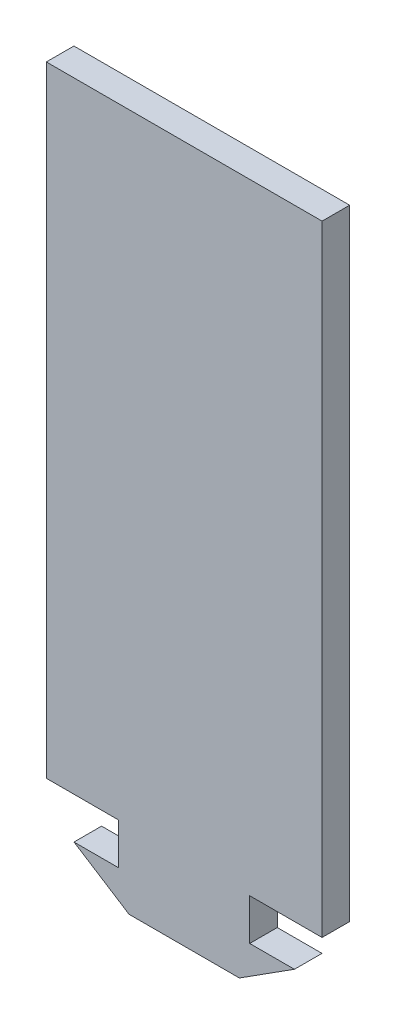
ISO-10303-21;
HEADER;
FILE_DESCRIPTION(('STEP AP214'),'2;1');
FILE_NAME('part.step','',(''),(''),'','','');
FILE_SCHEMA(('AUTOMOTIVE_DESIGN { 1 0 10303 214 1 1 1 1 }'));
ENDSEC;
DATA;
#1=APPLICATION_CONTEXT('core data for automotive mechanical design processes');
#2=APPLICATION_PROTOCOL_DEFINITION('international standard','automotive_design',2000,#1);
#3=PRODUCT_CONTEXT('',#1,'mechanical');
#4=PRODUCT('Part','Part','',(#3));
#5=PRODUCT_RELATED_PRODUCT_CATEGORY('part','',(#4));
#6=PRODUCT_DEFINITION_FORMATION('','',#4);
#7=PRODUCT_DEFINITION_CONTEXT('part definition',#1,'design');
#8=PRODUCT_DEFINITION('design','',#6,#7);
#9=PRODUCT_DEFINITION_SHAPE('','',#8);
#10=(LENGTH_UNIT() NAMED_UNIT(*) SI_UNIT(.MILLI.,.METRE.));
#11=(NAMED_UNIT(*) PLANE_ANGLE_UNIT() SI_UNIT($,.RADIAN.));
#12=(NAMED_UNIT(*) SI_UNIT($,.STERADIAN.) SOLID_ANGLE_UNIT());
#13=UNCERTAINTY_MEASURE_WITH_UNIT(LENGTH_MEASURE(1.E-05),#10,'distance_accuracy_value','');
#14=(GEOMETRIC_REPRESENTATION_CONTEXT(3) GLOBAL_UNCERTAINTY_ASSIGNED_CONTEXT((#13)) GLOBAL_UNIT_ASSIGNED_CONTEXT((#10,
#11,#12)) REPRESENTATION_CONTEXT('',''));
#15=CARTESIAN_POINT('',(0.,0.,0.));
#16=DIRECTION('',(0.,0.,1.));
#17=DIRECTION('',(1.,0.,0.));
#18=AXIS2_PLACEMENT_3D('',#15,#16,#17);
#19=CARTESIAN_POINT('',(-10.,-22.5,2.));
#20=DIRECTION('',(1.,0.,0.));
#21=DIRECTION('',(0.,0.,-1.));
#22=AXIS2_PLACEMENT_3D('',#19,#20,#21);
#23=PLANE('',#22);
#24=DIRECTION('',(0.,-1.,0.));
#25=VECTOR('',#24,1.);
#26=CARTESIAN_POINT('',(-10.,-22.5,0.));
#27=LINE('',#26,#25);
#28=CARTESIAN_POINT('',(-10.,22.5,0.));
#29=VERTEX_POINT('',#28);
#30=CARTESIAN_POINT('',(-10.,-22.5,0.));
#31=VERTEX_POINT('',#30);
#32=EDGE_CURVE('E170',#29,#31,#27,.T.);
#33=ORIENTED_EDGE('',*,*,#32,.T.);
#34=DIRECTION('',(0.,0.,-1.));
#35=VECTOR('',#34,1.);
#36=CARTESIAN_POINT('',(-10.,-22.5,2.));
#37=LINE('',#36,#35);
#38=CARTESIAN_POINT('',(-10.,-22.5,2.));
#39=VERTEX_POINT('',#38);
#40=EDGE_CURVE('E11',#39,#31,#37,.T.);
#41=ORIENTED_EDGE('',*,*,#40,.F.);
#42=DIRECTION('',(0.,-1.,0.));
#43=VECTOR('',#42,1.);
#44=CARTESIAN_POINT('',(-10.,-22.5,2.));
#45=LINE('',#44,#43);
#46=CARTESIAN_POINT('',(-10.,22.5,2.));
#47=VERTEX_POINT('',#46);
#48=EDGE_CURVE('E204',#47,#39,#45,.T.);
#49=ORIENTED_EDGE('',*,*,#48,.F.);
#50=DIRECTION('',(0.,0.,-1.));
#51=VECTOR('',#50,1.);
#52=CARTESIAN_POINT('',(-10.,22.5,2.));
#53=LINE('',#52,#51);
#54=EDGE_CURVE('E166',#47,#29,#53,.T.);
#55=ORIENTED_EDGE('',*,*,#54,.T.);
#56=EDGE_LOOP('',(#33,#41,#49,#55));
#57=FACE_BOUND('',#56,.T.);
#58=ADVANCED_FACE('F45',(#57),#23,.F.);
#59=CARTESIAN_POINT('',(-4.75,-22.5,2.));
#60=DIRECTION('',(0.,1.,0.));
#61=DIRECTION('',(-1.,0.,0.));
#62=AXIS2_PLACEMENT_3D('',#59,#60,#61);
#63=PLANE('',#62);
#64=DIRECTION('',(1.,0.,0.));
#65=VECTOR('',#64,1.);
#66=CARTESIAN_POINT('',(-4.75,-22.5,0.));
#67=LINE('',#66,#65);
#68=CARTESIAN_POINT('',(-4.75,-22.5,0.));
#69=VERTEX_POINT('',#68);
#70=EDGE_CURVE('E174',#31,#69,#67,.T.);
#71=ORIENTED_EDGE('',*,*,#70,.T.);
#72=DIRECTION('',(0.,0.,-1.));
#73=VECTOR('',#72,1.);
#74=CARTESIAN_POINT('',(-4.75,-22.5,2.));
#75=LINE('',#74,#73);
#76=CARTESIAN_POINT('',(-4.75,-22.5,2.));
#77=VERTEX_POINT('',#76);
#78=EDGE_CURVE('E54',#77,#69,#75,.T.);
#79=ORIENTED_EDGE('',*,*,#78,.F.);
#80=DIRECTION('',(1.,0.,0.));
#81=VECTOR('',#80,1.);
#82=CARTESIAN_POINT('',(-4.75,-22.5,2.));
#83=LINE('',#82,#81);
#84=EDGE_CURVE('E117',#39,#77,#83,.T.);
#85=ORIENTED_EDGE('',*,*,#84,.F.);
#86=ORIENTED_EDGE('',*,*,#40,.T.);
#87=EDGE_LOOP('',(#71,#79,#85,#86));
#88=FACE_BOUND('',#87,.T.);
#89=ADVANCED_FACE('F298',(#88),#63,.F.);
#90=CARTESIAN_POINT('',(-4.75,-25.5,2.));
#91=DIRECTION('',(1.,0.,0.));
#92=DIRECTION('',(0.,1.,0.));
#93=AXIS2_PLACEMENT_3D('',#90,#91,#92);
#94=PLANE('',#93);
#95=DIRECTION('',(0.,-1.,0.));
#96=VECTOR('',#95,1.);
#97=CARTESIAN_POINT('',(-4.75,-25.5,0.));
#98=LINE('',#97,#96);
#99=CARTESIAN_POINT('',(-4.75,-25.5,0.));
#100=VERTEX_POINT('',#99);
#101=EDGE_CURVE('E177',#69,#100,#98,.T.);
#102=ORIENTED_EDGE('',*,*,#101,.T.);
#103=DIRECTION('',(0.,0.,-1.));
#104=VECTOR('',#103,1.);
#105=CARTESIAN_POINT('',(-4.75,-25.5,2.));
#106=LINE('',#105,#104);
#107=CARTESIAN_POINT('',(-4.75,-25.5,2.));
#108=VERTEX_POINT('',#107);
#109=EDGE_CURVE('E231',#108,#100,#106,.T.);
#110=ORIENTED_EDGE('',*,*,#109,.F.);
#111=DIRECTION('',(0.,-1.,0.));
#112=VECTOR('',#111,1.);
#113=CARTESIAN_POINT('',(-4.75,-25.5,2.));
#114=LINE('',#113,#112);
#115=EDGE_CURVE('E241',#77,#108,#114,.T.);
#116=ORIENTED_EDGE('',*,*,#115,.F.);
#117=ORIENTED_EDGE('',*,*,#78,.T.);
#118=EDGE_LOOP('',(#102,#110,#116,#117));
#119=FACE_BOUND('',#118,.T.);
#120=ADVANCED_FACE('F239',(#119),#94,.F.);
#121=CARTESIAN_POINT('',(-4.75,-25.5,2.));
#122=DIRECTION('',(0.,-1.,0.));
#123=DIRECTION('',(0.,0.,-1.));
#124=AXIS2_PLACEMENT_3D('',#121,#122,#123);
#125=PLANE('',#124);
#126=DIRECTION('',(-1.,0.,0.));
#127=VECTOR('',#126,1.);
#128=CARTESIAN_POINT('',(-4.75,-25.5,0.));
#129=LINE('',#128,#127);
#130=CARTESIAN_POINT('',(-7.99412202859091,-25.5,0.));
#131=VERTEX_POINT('',#130);
#132=EDGE_CURVE('E180',#100,#131,#129,.T.);
#133=ORIENTED_EDGE('',*,*,#132,.T.);
#134=DIRECTION('',(0.,0.,-1.));
#135=VECTOR('',#134,1.);
#136=CARTESIAN_POINT('',(-7.99412202859091,-25.5,2.));
#137=LINE('',#136,#135);
#138=CARTESIAN_POINT('',(-7.99412202859091,-25.5,2.));
#139=VERTEX_POINT('',#138);
#140=EDGE_CURVE('E227',#139,#131,#137,.T.);
#141=ORIENTED_EDGE('',*,*,#140,.F.);
#142=DIRECTION('',(-1.,0.,0.));
#143=VECTOR('',#142,1.);
#144=CARTESIAN_POINT('',(-4.75,-25.5,2.));
#145=LINE('',#144,#143);
#146=EDGE_CURVE('E260',#108,#139,#145,.T.);
#147=ORIENTED_EDGE('',*,*,#146,.F.);
#148=ORIENTED_EDGE('',*,*,#109,.T.);
#149=EDGE_LOOP('',(#133,#141,#147,#148));
#150=FACE_BOUND('',#149,.T.);
#151=ADVANCED_FACE('F250',(#150),#125,.F.);
#152=CARTESIAN_POINT('',(-7.99412202859091,-25.5,2.));
#153=DIRECTION('',(0.537210435880766,0.843448248312128,0.));
#154=DIRECTION('',(-0.843448248312128,0.537210435880766,0.));
#155=AXIS2_PLACEMENT_3D('',#152,#153,#154);
#156=PLANE('',#155);
#157=DIRECTION('',(0.843448248312128,-0.537210435880766,0.));
#158=VECTOR('',#157,1.);
#159=CARTESIAN_POINT('',(-7.99412202859091,-25.5,0.));
#160=LINE('',#159,#158);
#161=CARTESIAN_POINT('',(-4.,-28.0439427258686,0.));
#162=VERTEX_POINT('',#161);
#163=EDGE_CURVE('E183',#131,#162,#160,.T.);
#164=ORIENTED_EDGE('',*,*,#163,.T.);
#165=DIRECTION('',(0.,0.,-1.));
#166=VECTOR('',#165,1.);
#167=CARTESIAN_POINT('',(-4.,-28.0439427258686,2.));
#168=LINE('',#167,#166);
#169=CARTESIAN_POINT('',(-4.,-28.0439427258686,2.));
#170=VERTEX_POINT('',#169);
#171=EDGE_CURVE('E223',#170,#162,#168,.T.);
#172=ORIENTED_EDGE('',*,*,#171,.F.);
#173=DIRECTION('',(0.843448248312128,-0.537210435880766,0.));
#174=VECTOR('',#173,1.);
#175=CARTESIAN_POINT('',(-7.99412202859091,-25.5,2.));
#176=LINE('',#175,#174);
#177=EDGE_CURVE('E256',#139,#170,#176,.T.);
#178=ORIENTED_EDGE('',*,*,#177,.F.);
#179=ORIENTED_EDGE('',*,*,#140,.T.);
#180=EDGE_LOOP('',(#164,#172,#178,#179));
#181=FACE_BOUND('',#180,.T.);
#182=ADVANCED_FACE('F254',(#181),#156,.F.);
#183=CARTESIAN_POINT('',(-4.,-28.0439427258686,2.));
#184=DIRECTION('',(0.,1.,0.));
#185=DIRECTION('',(0.,0.,1.));
#186=AXIS2_PLACEMENT_3D('',#183,#184,#185);
#187=PLANE('',#186);
#188=DIRECTION('',(1.,0.,0.));
#189=VECTOR('',#188,1.);
#190=CARTESIAN_POINT('',(-4.,-28.0439427258686,0.));
#191=LINE('',#190,#189);
#192=CARTESIAN_POINT('',(4.,-28.0439427258686,0.));
#193=VERTEX_POINT('',#192);
#194=EDGE_CURVE('E186',#162,#193,#191,.T.);
#195=ORIENTED_EDGE('',*,*,#194,.T.);
#196=DIRECTION('',(0.,0.,-1.));
#197=VECTOR('',#196,1.);
#198=CARTESIAN_POINT('',(4.,-28.0439427258686,2.));
#199=LINE('',#198,#197);
#200=CARTESIAN_POINT('',(4.,-28.0439427258686,2.));
#201=VERTEX_POINT('',#200);
#202=EDGE_CURVE('E219',#201,#193,#199,.T.);
#203=ORIENTED_EDGE('',*,*,#202,.F.);
#204=DIRECTION('',(1.,0.,0.));
#205=VECTOR('',#204,1.);
#206=CARTESIAN_POINT('',(-4.,-28.0439427258686,2.));
#207=LINE('',#206,#205);
#208=EDGE_CURVE('E259',#170,#201,#207,.T.);
#209=ORIENTED_EDGE('',*,*,#208,.F.);
#210=ORIENTED_EDGE('',*,*,#171,.T.);
#211=EDGE_LOOP('',(#195,#203,#209,#210));
#212=FACE_BOUND('',#211,.T.);
#213=ADVANCED_FACE('F311',(#212),#187,.F.);
#214=CARTESIAN_POINT('',(4.,-28.0439427258686,2.));
#215=DIRECTION('',(-0.537210435880766,0.843448248312128,0.));
#216=DIRECTION('',(-0.843448248312128,-0.537210435880766,0.));
#217=AXIS2_PLACEMENT_3D('',#214,#215,#216);
#218=PLANE('',#217);
#219=DIRECTION('',(0.843448248312128,0.537210435880766,0.));
#220=VECTOR('',#219,1.);
#221=CARTESIAN_POINT('',(4.,-28.0439427258686,0.));
#222=LINE('',#221,#220);
#223=CARTESIAN_POINT('',(7.99412202859091,-25.5,0.));
#224=VERTEX_POINT('',#223);
#225=EDGE_CURVE('E189',#193,#224,#222,.T.);
#226=ORIENTED_EDGE('',*,*,#225,.T.);
#227=DIRECTION('',(0.,0.,-1.));
#228=VECTOR('',#227,1.);
#229=CARTESIAN_POINT('',(7.99412202859091,-25.5,2.));
#230=LINE('',#229,#228);
#231=CARTESIAN_POINT('',(7.99412202859091,-25.5,2.));
#232=VERTEX_POINT('',#231);
#233=EDGE_CURVE('E215',#232,#224,#230,.T.);
#234=ORIENTED_EDGE('',*,*,#233,.F.);
#235=DIRECTION('',(0.843448248312128,0.537210435880766,0.));
#236=VECTOR('',#235,1.);
#237=CARTESIAN_POINT('',(4.,-28.0439427258686,2.));
#238=LINE('',#237,#236);
#239=EDGE_CURVE('E264',#201,#232,#238,.T.);
#240=ORIENTED_EDGE('',*,*,#239,.F.);
#241=ORIENTED_EDGE('',*,*,#202,.T.);
#242=EDGE_LOOP('',(#226,#234,#240,#241));
#243=FACE_BOUND('',#242,.T.);
#244=ADVANCED_FACE('F314',(#243),#218,.F.);
#245=CARTESIAN_POINT('',(4.75,-25.5,2.));
#246=DIRECTION('',(0.,-1.,0.));
#247=DIRECTION('',(1.,0.,0.));
#248=AXIS2_PLACEMENT_3D('',#245,#246,#247);
#249=PLANE('',#248);
#250=DIRECTION('',(-1.,0.,0.));
#251=VECTOR('',#250,1.);
#252=CARTESIAN_POINT('',(4.75,-25.5,0.));
#253=LINE('',#252,#251);
#254=CARTESIAN_POINT('',(4.75,-25.5,0.));
#255=VERTEX_POINT('',#254);
#256=EDGE_CURVE('E192',#224,#255,#253,.T.);
#257=ORIENTED_EDGE('',*,*,#256,.T.);
#258=DIRECTION('',(0.,0.,-1.));
#259=VECTOR('',#258,1.);
#260=CARTESIAN_POINT('',(4.75,-25.5,2.));
#261=LINE('',#260,#259);
#262=CARTESIAN_POINT('',(4.75,-25.5,2.));
#263=VERTEX_POINT('',#262);
#264=EDGE_CURVE('E211',#263,#255,#261,.T.);
#265=ORIENTED_EDGE('',*,*,#264,.F.);
#266=DIRECTION('',(-1.,0.,0.));
#267=VECTOR('',#266,1.);
#268=CARTESIAN_POINT('',(4.75,-25.5,2.));
#269=LINE('',#268,#267);
#270=EDGE_CURVE('E271',#232,#263,#269,.T.);
#271=ORIENTED_EDGE('',*,*,#270,.F.);
#272=ORIENTED_EDGE('',*,*,#233,.T.);
#273=EDGE_LOOP('',(#257,#265,#271,#272));
#274=FACE_BOUND('',#273,.T.);
#275=ADVANCED_FACE('F279',(#274),#249,.F.);
#276=CARTESIAN_POINT('',(4.75,-25.5,2.));
#277=DIRECTION('',(-1.,0.,0.));
#278=DIRECTION('',(0.,-1.,0.));
#279=AXIS2_PLACEMENT_3D('',#276,#277,#278);
#280=PLANE('',#279);
#281=DIRECTION('',(0.,1.,0.));
#282=VECTOR('',#281,1.);
#283=CARTESIAN_POINT('',(4.75,-25.5,0.));
#284=LINE('',#283,#282);
#285=CARTESIAN_POINT('',(4.75,-22.5,0.));
#286=VERTEX_POINT('',#285);
#287=EDGE_CURVE('E195',#255,#286,#284,.T.);
#288=ORIENTED_EDGE('',*,*,#287,.T.);
#289=DIRECTION('',(0.,0.,-1.));
#290=VECTOR('',#289,1.);
#291=CARTESIAN_POINT('',(4.75,-22.5,2.));
#292=LINE('',#291,#290);
#293=CARTESIAN_POINT('',(4.75,-22.5,2.));
#294=VERTEX_POINT('',#293);
#295=EDGE_CURVE('E159',#294,#286,#292,.T.);
#296=ORIENTED_EDGE('',*,*,#295,.F.);
#297=DIRECTION('',(0.,1.,0.));
#298=VECTOR('',#297,1.);
#299=CARTESIAN_POINT('',(4.75,-25.5,2.));
#300=LINE('',#299,#298);
#301=EDGE_CURVE('E148',#263,#294,#300,.T.);
#302=ORIENTED_EDGE('',*,*,#301,.F.);
#303=ORIENTED_EDGE('',*,*,#264,.T.);
#304=EDGE_LOOP('',(#288,#296,#302,#303));
#305=FACE_BOUND('',#304,.T.);
#306=ADVANCED_FACE('F283',(#305),#280,.F.);
#307=CARTESIAN_POINT('',(10.,-22.5,2.));
#308=DIRECTION('',(0.,1.,0.));
#309=DIRECTION('',(-1.,0.,0.));
#310=AXIS2_PLACEMENT_3D('',#307,#308,#309);
#311=PLANE('',#310);
#312=DIRECTION('',(1.,0.,0.));
#313=VECTOR('',#312,1.);
#314=CARTESIAN_POINT('',(10.,-22.5,0.));
#315=LINE('',#314,#313);
#316=CARTESIAN_POINT('',(10.,-22.5,0.));
#317=VERTEX_POINT('',#316);
#318=EDGE_CURVE('E157',#286,#317,#315,.T.);
#319=ORIENTED_EDGE('',*,*,#318,.T.);
#320=DIRECTION('',(0.,0.,-1.));
#321=VECTOR('',#320,1.);
#322=CARTESIAN_POINT('',(10.,-22.5,2.));
#323=LINE('',#322,#321);
#324=CARTESIAN_POINT('',(10.,-22.5,2.));
#325=VERTEX_POINT('',#324);
#326=EDGE_CURVE('E154',#325,#317,#323,.T.);
#327=ORIENTED_EDGE('',*,*,#326,.F.);
#328=DIRECTION('',(1.,0.,0.));
#329=VECTOR('',#328,1.);
#330=CARTESIAN_POINT('',(10.,-22.5,2.));
#331=LINE('',#330,#329);
#332=EDGE_CURVE('E142',#294,#325,#331,.T.);
#333=ORIENTED_EDGE('',*,*,#332,.F.);
#334=ORIENTED_EDGE('',*,*,#295,.T.);
#335=EDGE_LOOP('',(#319,#327,#333,#334));
#336=FACE_BOUND('',#335,.T.);
#337=ADVANCED_FACE('F155',(#336),#311,.F.);
#338=CARTESIAN_POINT('',(10.,-22.5,2.));
#339=DIRECTION('',(-1.,0.,0.));
#340=DIRECTION('',(0.,0.,1.));
#341=AXIS2_PLACEMENT_3D('',#338,#339,#340);
#342=PLANE('',#341);
#343=DIRECTION('',(0.,1.,0.));
#344=VECTOR('',#343,1.);
#345=CARTESIAN_POINT('',(10.,-22.5,0.));
#346=LINE('',#345,#344);
#347=CARTESIAN_POINT('',(10.,22.5,0.));
#348=VERTEX_POINT('',#347);
#349=EDGE_CURVE('E103',#317,#348,#346,.T.);
#350=ORIENTED_EDGE('',*,*,#349,.T.);
#351=DIRECTION('',(0.,0.,-1.));
#352=VECTOR('',#351,1.);
#353=CARTESIAN_POINT('',(10.,22.5,2.));
#354=LINE('',#353,#352);
#355=CARTESIAN_POINT('',(10.,22.5,2.));
#356=VERTEX_POINT('',#355);
#357=EDGE_CURVE('E160',#356,#348,#354,.T.);
#358=ORIENTED_EDGE('',*,*,#357,.F.);
#359=DIRECTION('',(0.,1.,0.));
#360=VECTOR('',#359,1.);
#361=CARTESIAN_POINT('',(10.,-22.5,2.));
#362=LINE('',#361,#360);
#363=EDGE_CURVE('E146',#325,#356,#362,.T.);
#364=ORIENTED_EDGE('',*,*,#363,.F.);
#365=ORIENTED_EDGE('',*,*,#326,.T.);
#366=EDGE_LOOP('',(#350,#358,#364,#365));
#367=FACE_BOUND('',#366,.T.);
#368=ADVANCED_FACE('F162',(#367),#342,.F.);
#369=CARTESIAN_POINT('',(10.,22.5,2.));
#370=DIRECTION('',(0.,-1.,0.));
#371=DIRECTION('',(0.,0.,-1.));
#372=AXIS2_PLACEMENT_3D('',#369,#370,#371);
#373=PLANE('',#372);
#374=DIRECTION('',(-1.,0.,0.));
#375=VECTOR('',#374,1.);
#376=CARTESIAN_POINT('',(10.,22.5,0.));
#377=LINE('',#376,#375);
#378=EDGE_CURVE('E109',#348,#29,#377,.T.);
#379=ORIENTED_EDGE('',*,*,#378,.T.);
#380=ORIENTED_EDGE('',*,*,#54,.F.);
#381=DIRECTION('',(-1.,0.,0.));
#382=VECTOR('',#381,1.);
#383=CARTESIAN_POINT('',(10.,22.5,2.));
#384=LINE('',#383,#382);
#385=EDGE_CURVE('E62',#356,#47,#384,.T.);
#386=ORIENTED_EDGE('',*,*,#385,.F.);
#387=ORIENTED_EDGE('',*,*,#357,.T.);
#388=EDGE_LOOP('',(#379,#380,#386,#387));
#389=FACE_BOUND('',#388,.T.);
#390=ADVANCED_FACE('F287',(#389),#373,.F.);
#391=CARTESIAN_POINT('',(0.,0.,2.));
#392=DIRECTION('',(0.,0.,1.));
#393=DIRECTION('',(1.,0.,0.));
#394=AXIS2_PLACEMENT_3D('',#391,#392,#393);
#395=PLANE('',#394);
#396=ORIENTED_EDGE('',*,*,#48,.T.);
#397=ORIENTED_EDGE('',*,*,#84,.T.);
#398=ORIENTED_EDGE('',*,*,#115,.T.);
#399=ORIENTED_EDGE('',*,*,#146,.T.);
#400=ORIENTED_EDGE('',*,*,#177,.T.);
#401=ORIENTED_EDGE('',*,*,#208,.T.);
#402=ORIENTED_EDGE('',*,*,#239,.T.);
#403=ORIENTED_EDGE('',*,*,#270,.T.);
#404=ORIENTED_EDGE('',*,*,#301,.T.);
#405=ORIENTED_EDGE('',*,*,#332,.T.);
#406=ORIENTED_EDGE('',*,*,#363,.T.);
#407=ORIENTED_EDGE('',*,*,#385,.T.);
#408=EDGE_LOOP('',(#396,#397,#398,#399,#400,#401,#402,#403,#404,#405,#406,#407));
#409=FACE_BOUND('',#408,.T.);
#410=ADVANCED_FACE('F144',(#409),#395,.T.);
#411=CARTESIAN_POINT('',(0.,0.,0.));
#412=DIRECTION('',(0.,0.,1.));
#413=DIRECTION('',(1.,0.,0.));
#414=AXIS2_PLACEMENT_3D('',#411,#412,#413);
#415=PLANE('',#414);
#416=ORIENTED_EDGE('',*,*,#32,.F.);
#417=ORIENTED_EDGE('',*,*,#378,.F.);
#418=ORIENTED_EDGE('',*,*,#349,.F.);
#419=ORIENTED_EDGE('',*,*,#318,.F.);
#420=ORIENTED_EDGE('',*,*,#287,.F.);
#421=ORIENTED_EDGE('',*,*,#256,.F.);
#422=ORIENTED_EDGE('',*,*,#225,.F.);
#423=ORIENTED_EDGE('',*,*,#194,.F.);
#424=ORIENTED_EDGE('',*,*,#163,.F.);
#425=ORIENTED_EDGE('',*,*,#132,.F.);
#426=ORIENTED_EDGE('',*,*,#101,.F.);
#427=ORIENTED_EDGE('',*,*,#70,.F.);
#428=EDGE_LOOP('',(#416,#417,#418,#419,#420,#421,#422,#423,#424,#425,#426,#427));
#429=FACE_BOUND('',#428,.T.);
#430=ADVANCED_FACE('F245',(#429),#415,.F.);
#431=CLOSED_SHELL('',(#58,#89,#120,#151,#182,#213,#244,#275,#306,#337,#368,#390,#410,#430));
#432=MANIFOLD_SOLID_BREP('B2',#431);
#433=ADVANCED_BREP_SHAPE_REPRESENTATION('',(#18,#432),#14);
#434=SHAPE_DEFINITION_REPRESENTATION(#9,#433);
ENDSEC;
END-ISO-10303-21;
